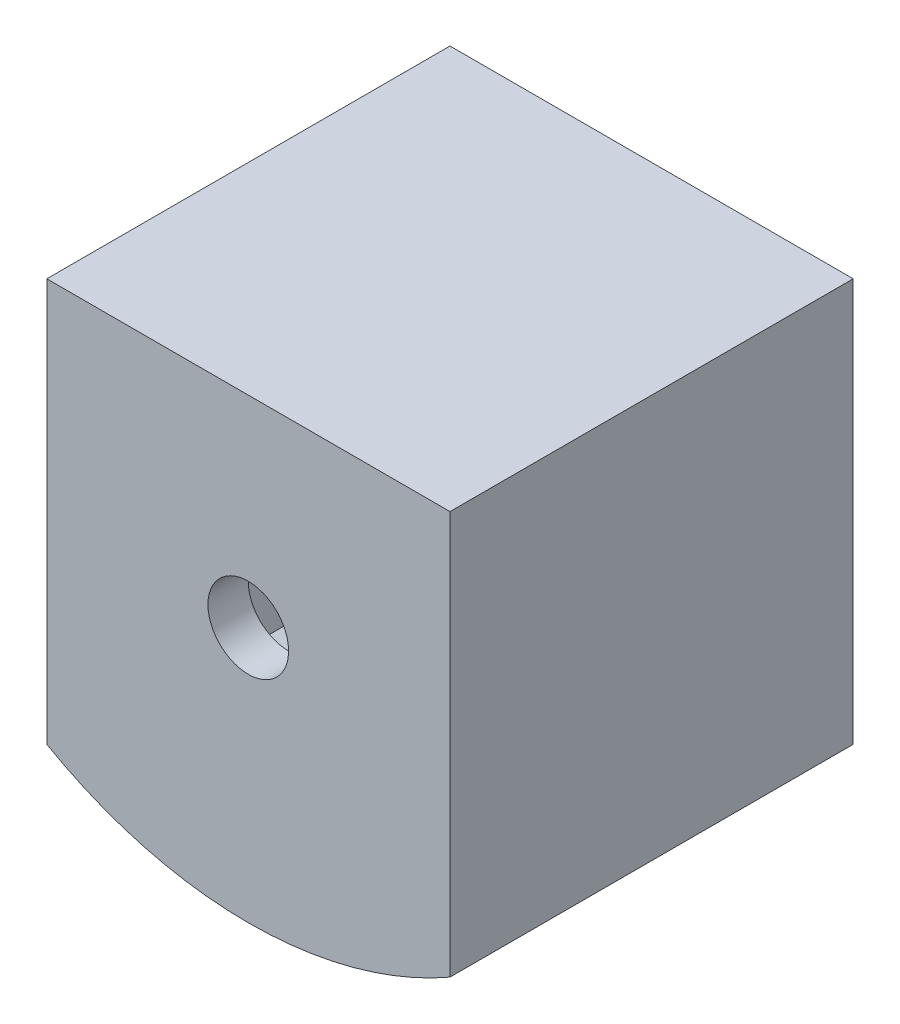
ISO-10303-21;
HEADER;
FILE_DESCRIPTION(('STEP AP214'),'2;1');
FILE_NAME('part.step','',(''),(''),'','','');
FILE_SCHEMA(('AUTOMOTIVE_DESIGN { 1 0 10303 214 1 1 1 1 }'));
ENDSEC;
DATA;
#1=APPLICATION_CONTEXT('core data for automotive mechanical design processes');
#2=APPLICATION_PROTOCOL_DEFINITION('international standard','automotive_design',2000,#1);
#3=PRODUCT_CONTEXT('',#1,'mechanical');
#4=PRODUCT('Part','Part','',(#3));
#5=PRODUCT_RELATED_PRODUCT_CATEGORY('part','',(#4));
#6=PRODUCT_DEFINITION_FORMATION('','',#4);
#7=PRODUCT_DEFINITION_CONTEXT('part definition',#1,'design');
#8=PRODUCT_DEFINITION('design','',#6,#7);
#9=PRODUCT_DEFINITION_SHAPE('','',#8);
#10=(LENGTH_UNIT() NAMED_UNIT(*) SI_UNIT(.MILLI.,.METRE.));
#11=(NAMED_UNIT(*) PLANE_ANGLE_UNIT() SI_UNIT($,.RADIAN.));
#12=(NAMED_UNIT(*) SI_UNIT($,.STERADIAN.) SOLID_ANGLE_UNIT());
#13=UNCERTAINTY_MEASURE_WITH_UNIT(LENGTH_MEASURE(1.E-05),#10,'distance_accuracy_value','');
#14=(GEOMETRIC_REPRESENTATION_CONTEXT(3) GLOBAL_UNCERTAINTY_ASSIGNED_CONTEXT((#13)) GLOBAL_UNIT_ASSIGNED_CONTEXT((#10,
#11,#12)) REPRESENTATION_CONTEXT('',''));
#15=CARTESIAN_POINT('',(0.,0.,0.));
#16=DIRECTION('',(0.,0.,1.));
#17=DIRECTION('',(1.,0.,0.));
#18=AXIS2_PLACEMENT_3D('',#15,#16,#17);
#19=CARTESIAN_POINT('',(-15.,-15.,30.));
#20=DIRECTION('',(1.,0.,0.));
#21=DIRECTION('',(0.,1.,0.));
#22=AXIS2_PLACEMENT_3D('',#19,#20,#21);
#23=PLANE('',#22);
#24=DIRECTION('',(0.,-1.,0.));
#25=VECTOR('',#24,1.);
#26=CARTESIAN_POINT('',(-15.,-15.,0.));
#27=LINE('',#26,#25);
#28=CARTESIAN_POINT('',(-15.,15.,0.));
#29=VERTEX_POINT('',#28);
#30=CARTESIAN_POINT('',(-15.,-15.,0.));
#31=VERTEX_POINT('',#30);
#32=EDGE_CURVE('E337',#29,#31,#27,.T.);
#33=ORIENTED_EDGE('',*,*,#32,.T.);
#34=DIRECTION('',(0.,0.,-1.));
#35=VECTOR('',#34,1.);
#36=CARTESIAN_POINT('',(-15.,-15.,30.));
#37=LINE('',#36,#35);
#38=CARTESIAN_POINT('',(-15.,-15.,30.));
#39=VERTEX_POINT('',#38);
#40=EDGE_CURVE('E11',#39,#31,#37,.T.);
#41=ORIENTED_EDGE('',*,*,#40,.F.);
#42=DIRECTION('',(0.,-1.,0.));
#43=VECTOR('',#42,1.);
#44=CARTESIAN_POINT('',(-15.,-15.,30.));
#45=LINE('',#44,#43);
#46=CARTESIAN_POINT('',(-15.,15.,30.));
#47=VERTEX_POINT('',#46);
#48=EDGE_CURVE('E365',#47,#39,#45,.T.);
#49=ORIENTED_EDGE('',*,*,#48,.F.);
#50=DIRECTION('',(0.,0.,-1.));
#51=VECTOR('',#50,1.);
#52=CARTESIAN_POINT('',(-15.,15.,30.));
#53=LINE('',#52,#51);
#54=EDGE_CURVE('E375',#47,#29,#53,.T.);
#55=ORIENTED_EDGE('',*,*,#54,.T.);
#56=EDGE_LOOP('',(#33,#41,#49,#55));
#57=FACE_BOUND('',#56,.T.);
#58=ADVANCED_FACE('F35',(#57),#23,.F.);
#59=CARTESIAN_POINT('',(0.,11.0897908705464,30.));
#60=DIRECTION('',(0.,0.,-1.));
#61=DIRECTION('',(-1.,0.,0.));
#62=AXIS2_PLACEMENT_3D('',#59,#60,#61);
#63=CYLINDRICAL_SURFACE('',#62,30.0944710481651);
#64=CARTESIAN_POINT('',(0.,11.0897908705464,0.));
#65=DIRECTION('',(0.,0.,1.));
#66=DIRECTION('',(1.,0.,0.));
#67=AXIS2_PLACEMENT_3D('',#64,#65,#66);
#68=CIRCLE('',#67,30.0944710481651);
#69=CARTESIAN_POINT('',(15.,-15.,0.));
#70=VERTEX_POINT('',#69);
#71=EDGE_CURVE('E378',#31,#70,#68,.T.);
#72=ORIENTED_EDGE('',*,*,#71,.T.);
#73=DIRECTION('',(0.,0.,-1.));
#74=VECTOR('',#73,1.);
#75=CARTESIAN_POINT('',(15.,-15.,30.));
#76=LINE('',#75,#74);
#77=CARTESIAN_POINT('',(15.,-15.,30.));
#78=VERTEX_POINT('',#77);
#79=EDGE_CURVE('E42',#78,#70,#76,.T.);
#80=ORIENTED_EDGE('',*,*,#79,.F.);
#81=CARTESIAN_POINT('',(0.,11.0897908705464,30.));
#82=DIRECTION('',(0.,0.,1.));
#83=DIRECTION('',(1.,0.,0.));
#84=AXIS2_PLACEMENT_3D('',#81,#82,#83);
#85=CIRCLE('',#84,30.0944710481651);
#86=EDGE_CURVE('E368',#39,#78,#85,.T.);
#87=ORIENTED_EDGE('',*,*,#86,.F.);
#88=ORIENTED_EDGE('',*,*,#40,.T.);
#89=EDGE_LOOP('',(#72,#80,#87,#88));
#90=FACE_BOUND('',#89,.T.);
#91=ADVANCED_FACE('F408',(#90),#63,.T.);
#92=CARTESIAN_POINT('',(15.,-15.,30.));
#93=DIRECTION('',(-1.,0.,0.));
#94=DIRECTION('',(0.,-1.,0.));
#95=AXIS2_PLACEMENT_3D('',#92,#93,#94);
#96=PLANE('',#95);
#97=DIRECTION('',(0.,1.,0.));
#98=VECTOR('',#97,1.);
#99=CARTESIAN_POINT('',(15.,-15.,0.));
#100=LINE('',#99,#98);
#101=CARTESIAN_POINT('',(15.,15.,0.));
#102=VERTEX_POINT('',#101);
#103=EDGE_CURVE('E380',#70,#102,#100,.T.);
#104=ORIENTED_EDGE('',*,*,#103,.T.);
#105=DIRECTION('',(0.,0.,-1.));
#106=VECTOR('',#105,1.);
#107=CARTESIAN_POINT('',(15.,15.,30.));
#108=LINE('',#107,#106);
#109=CARTESIAN_POINT('',(15.,15.,30.));
#110=VERTEX_POINT('',#109);
#111=EDGE_CURVE('E385',#110,#102,#108,.T.);
#112=ORIENTED_EDGE('',*,*,#111,.F.);
#113=DIRECTION('',(0.,1.,0.));
#114=VECTOR('',#113,1.);
#115=CARTESIAN_POINT('',(15.,-15.,30.));
#116=LINE('',#115,#114);
#117=EDGE_CURVE('E371',#78,#110,#116,.T.);
#118=ORIENTED_EDGE('',*,*,#117,.F.);
#119=ORIENTED_EDGE('',*,*,#79,.T.);
#120=EDGE_LOOP('',(#104,#112,#118,#119));
#121=FACE_BOUND('',#120,.T.);
#122=ADVANCED_FACE('F392',(#121),#96,.F.);
#123=CARTESIAN_POINT('',(15.,15.,30.));
#124=DIRECTION('',(0.,-1.,0.));
#125=DIRECTION('',(0.,0.,-1.));
#126=AXIS2_PLACEMENT_3D('',#123,#124,#125);
#127=PLANE('',#126);
#128=DIRECTION('',(-1.,0.,0.));
#129=VECTOR('',#128,1.);
#130=CARTESIAN_POINT('',(15.,15.,0.));
#131=LINE('',#130,#129);
#132=EDGE_CURVE('E369',#102,#29,#131,.T.);
#133=ORIENTED_EDGE('',*,*,#132,.T.);
#134=ORIENTED_EDGE('',*,*,#54,.F.);
#135=DIRECTION('',(-1.,0.,0.));
#136=VECTOR('',#135,1.);
#137=CARTESIAN_POINT('',(15.,15.,30.));
#138=LINE('',#137,#136);
#139=EDGE_CURVE('E373',#110,#47,#138,.T.);
#140=ORIENTED_EDGE('',*,*,#139,.F.);
#141=ORIENTED_EDGE('',*,*,#111,.T.);
#142=EDGE_LOOP('',(#133,#134,#140,#141));
#143=FACE_BOUND('',#142,.T.);
#144=ADVANCED_FACE('F401',(#143),#127,.F.);
#145=CARTESIAN_POINT('',(0.,11.0897908705464,30.));
#146=DIRECTION('',(0.,0.,1.));
#147=DIRECTION('',(1.,0.,0.));
#148=AXIS2_PLACEMENT_3D('',#145,#146,#147);
#149=PLANE('',#148);
#150=CARTESIAN_POINT('',(-0.0102597379063596,0.00757269740248034,30.));
#151=DIRECTION('',(0.,0.,-1.));
#152=DIRECTION('',(-1.,0.,0.));
#153=AXIS2_PLACEMENT_3D('',#150,#151,#152);
#154=CIRCLE('',#153,3.);
#155=CARTESIAN_POINT('',(-3.01025973790636,0.00757269740248034,30.));
#156=VERTEX_POINT('',#155);
#157=EDGE_CURVE('E328',#156,#156,#154,.T.);
#158=ORIENTED_EDGE('',*,*,#157,.T.);
#159=EDGE_LOOP('',(#158));
#160=FACE_BOUND('',#159,.T.);
#161=ORIENTED_EDGE('',*,*,#48,.T.);
#162=ORIENTED_EDGE('',*,*,#86,.T.);
#163=ORIENTED_EDGE('',*,*,#117,.T.);
#164=ORIENTED_EDGE('',*,*,#139,.T.);
#165=EDGE_LOOP('',(#161,#162,#163,#164));
#166=FACE_BOUND('',#165,.T.);
#167=ADVANCED_FACE('F407',(#160,#166),#149,.T.);
#168=CARTESIAN_POINT('',(0.,11.0897908705464,0.));
#169=DIRECTION('',(0.,0.,1.));
#170=DIRECTION('',(1.,0.,0.));
#171=AXIS2_PLACEMENT_3D('',#168,#169,#170);
#172=PLANE('',#171);
#173=DIRECTION('',(-1.,0.,0.));
#174=VECTOR('',#173,1.);
#175=CARTESIAN_POINT('',(5.,13.,0.));
#176=LINE('',#175,#174);
#177=CARTESIAN_POINT('',(5.,13.,0.));
#178=VERTEX_POINT('',#177);
#179=CARTESIAN_POINT('',(-5.,13.,0.));
#180=VERTEX_POINT('',#179);
#181=EDGE_CURVE('E224',#178,#180,#176,.T.);
#182=ORIENTED_EDGE('',*,*,#181,.F.);
#183=DIRECTION('',(0.,-1.,0.));
#184=VECTOR('',#183,1.);
#185=CARTESIAN_POINT('',(5.,14.,0.));
#186=LINE('',#185,#184);
#187=CARTESIAN_POINT('',(5.,14.,0.));
#188=VERTEX_POINT('',#187);
#189=EDGE_CURVE('E49',#188,#178,#186,.T.);
#190=ORIENTED_EDGE('',*,*,#189,.F.);
#191=DIRECTION('',(1.,0.,0.));
#192=VECTOR('',#191,1.);
#193=CARTESIAN_POINT('',(5.,14.,0.));
#194=LINE('',#193,#192);
#195=CARTESIAN_POINT('',(-5.,14.,0.));
#196=VERTEX_POINT('',#195);
#197=EDGE_CURVE('E215',#196,#188,#194,.T.);
#198=ORIENTED_EDGE('',*,*,#197,.F.);
#199=DIRECTION('',(0.,1.,0.));
#200=VECTOR('',#199,1.);
#201=CARTESIAN_POINT('',(-5.,14.,0.));
#202=LINE('',#201,#200);
#203=EDGE_CURVE('E218',#180,#196,#202,.T.);
#204=ORIENTED_EDGE('',*,*,#203,.F.);
#205=EDGE_LOOP('',(#182,#190,#198,#204));
#206=FACE_BOUND('',#205,.T.);
#207=DIRECTION('',(-1.,0.,0.));
#208=VECTOR('',#207,1.);
#209=CARTESIAN_POINT('',(14.,-5.,0.));
#210=LINE('',#209,#208);
#211=CARTESIAN_POINT('',(14.,-5.,0.));
#212=VERTEX_POINT('',#211);
#213=CARTESIAN_POINT('',(13.,-5.,0.));
#214=VERTEX_POINT('',#213);
#215=EDGE_CURVE('E250',#212,#214,#210,.T.);
#216=ORIENTED_EDGE('',*,*,#215,.F.);
#217=DIRECTION('',(0.,-1.,0.));
#218=VECTOR('',#217,1.);
#219=CARTESIAN_POINT('',(14.,5.,0.));
#220=LINE('',#219,#218);
#221=CARTESIAN_POINT('',(14.,5.,0.));
#222=VERTEX_POINT('',#221);
#223=EDGE_CURVE('E57',#222,#212,#220,.T.);
#224=ORIENTED_EDGE('',*,*,#223,.F.);
#225=DIRECTION('',(1.,0.,0.));
#226=VECTOR('',#225,1.);
#227=CARTESIAN_POINT('',(14.,5.,0.));
#228=LINE('',#227,#226);
#229=CARTESIAN_POINT('',(13.,5.,0.));
#230=VERTEX_POINT('',#229);
#231=EDGE_CURVE('E239',#230,#222,#228,.T.);
#232=ORIENTED_EDGE('',*,*,#231,.F.);
#233=DIRECTION('',(0.,1.,0.));
#234=VECTOR('',#233,1.);
#235=CARTESIAN_POINT('',(13.,5.,0.));
#236=LINE('',#235,#234);
#237=EDGE_CURVE('E254',#214,#230,#236,.T.);
#238=ORIENTED_EDGE('',*,*,#237,.F.);
#239=EDGE_LOOP('',(#216,#224,#232,#238));
#240=FACE_BOUND('',#239,.T.);
#241=DIRECTION('',(-1.,0.,0.));
#242=VECTOR('',#241,1.);
#243=CARTESIAN_POINT('',(3.5,-18.,0.));
#244=LINE('',#243,#242);
#245=CARTESIAN_POINT('',(3.5,-18.,0.));
#246=VERTEX_POINT('',#245);
#247=CARTESIAN_POINT('',(-3.5,-18.,0.));
#248=VERTEX_POINT('',#247);
#249=EDGE_CURVE('E281',#246,#248,#244,.T.);
#250=ORIENTED_EDGE('',*,*,#249,.F.);
#251=DIRECTION('',(0.,-1.,0.));
#252=VECTOR('',#251,1.);
#253=CARTESIAN_POINT('',(3.5,-17.,0.));
#254=LINE('',#253,#252);
#255=CARTESIAN_POINT('',(3.5,-17.,0.));
#256=VERTEX_POINT('',#255);
#257=EDGE_CURVE('E279',#256,#246,#254,.T.);
#258=ORIENTED_EDGE('',*,*,#257,.F.);
#259=DIRECTION('',(1.,0.,0.));
#260=VECTOR('',#259,1.);
#261=CARTESIAN_POINT('',(3.5,-17.,0.));
#262=LINE('',#261,#260);
#263=CARTESIAN_POINT('',(-3.5,-17.,0.));
#264=VERTEX_POINT('',#263);
#265=EDGE_CURVE('E269',#264,#256,#262,.T.);
#266=ORIENTED_EDGE('',*,*,#265,.F.);
#267=DIRECTION('',(0.,1.,0.));
#268=VECTOR('',#267,1.);
#269=CARTESIAN_POINT('',(-3.5,-17.,0.));
#270=LINE('',#269,#268);
#271=EDGE_CURVE('E285',#248,#264,#270,.T.);
#272=ORIENTED_EDGE('',*,*,#271,.F.);
#273=EDGE_LOOP('',(#250,#258,#266,#272));
#274=FACE_BOUND('',#273,.T.);
#275=DIRECTION('',(-1.,0.,0.));
#276=VECTOR('',#275,1.);
#277=CARTESIAN_POINT('',(-13.,-5.,0.));
#278=LINE('',#277,#276);
#279=CARTESIAN_POINT('',(-13.,-5.,0.));
#280=VERTEX_POINT('',#279);
#281=CARTESIAN_POINT('',(-14.,-5.,0.));
#282=VERTEX_POINT('',#281);
#283=EDGE_CURVE('E313',#280,#282,#278,.T.);
#284=ORIENTED_EDGE('',*,*,#283,.F.);
#285=DIRECTION('',(0.,-1.,0.));
#286=VECTOR('',#285,1.);
#287=CARTESIAN_POINT('',(-13.,5.,0.));
#288=LINE('',#287,#286);
#289=CARTESIAN_POINT('',(-13.,5.,0.));
#290=VERTEX_POINT('',#289);
#291=EDGE_CURVE('E311',#290,#280,#288,.T.);
#292=ORIENTED_EDGE('',*,*,#291,.F.);
#293=DIRECTION('',(1.,0.,0.));
#294=VECTOR('',#293,1.);
#295=CARTESIAN_POINT('',(-13.,5.,0.));
#296=LINE('',#295,#294);
#297=CARTESIAN_POINT('',(-14.,5.,0.));
#298=VERTEX_POINT('',#297);
#299=EDGE_CURVE('E301',#298,#290,#296,.T.);
#300=ORIENTED_EDGE('',*,*,#299,.F.);
#301=DIRECTION('',(0.,1.,0.));
#302=VECTOR('',#301,1.);
#303=CARTESIAN_POINT('',(-14.,5.,0.));
#304=LINE('',#303,#302);
#305=EDGE_CURVE('E316',#282,#298,#304,.T.);
#306=ORIENTED_EDGE('',*,*,#305,.F.);
#307=EDGE_LOOP('',(#284,#292,#300,#306));
#308=FACE_BOUND('',#307,.T.);
#309=DIRECTION('',(-1.,0.,0.));
#310=VECTOR('',#309,1.);
#311=CARTESIAN_POINT('',(15.,12.,0.));
#312=LINE('',#311,#310);
#313=CARTESIAN_POINT('',(12.,12.,0.));
#314=VERTEX_POINT('',#313);
#315=CARTESIAN_POINT('',(-12.,12.,0.));
#316=VERTEX_POINT('',#315);
#317=EDGE_CURVE('E343',#314,#316,#312,.T.);
#318=ORIENTED_EDGE('',*,*,#317,.T.);
#319=DIRECTION('',(0.,-1.,0.));
#320=VECTOR('',#319,1.);
#321=CARTESIAN_POINT('',(-12.,-15.,0.));
#322=LINE('',#321,#320);
#323=CARTESIAN_POINT('',(-12.,-13.2023963792641,0.));
#324=VERTEX_POINT('',#323);
#325=EDGE_CURVE('E331',#316,#324,#322,.T.);
#326=ORIENTED_EDGE('',*,*,#325,.T.);
#327=CARTESIAN_POINT('',(0.,11.0897908705464,0.));
#328=DIRECTION('',(0.,0.,1.));
#329=DIRECTION('',(1.,0.,0.));
#330=AXIS2_PLACEMENT_3D('',#327,#328,#329);
#331=CIRCLE('',#330,27.0944710481651);
#332=CARTESIAN_POINT('',(12.,-13.2023963792641,0.));
#333=VERTEX_POINT('',#332);
#334=EDGE_CURVE('E357',#324,#333,#331,.T.);
#335=ORIENTED_EDGE('',*,*,#334,.T.);
#336=DIRECTION('',(0.,1.,0.));
#337=VECTOR('',#336,1.);
#338=CARTESIAN_POINT('',(12.,-15.,0.));
#339=LINE('',#338,#337);
#340=EDGE_CURVE('E360',#333,#314,#339,.T.);
#341=ORIENTED_EDGE('',*,*,#340,.T.);
#342=EDGE_LOOP('',(#318,#326,#335,#341));
#343=FACE_BOUND('',#342,.T.);
#344=ORIENTED_EDGE('',*,*,#32,.F.);
#345=ORIENTED_EDGE('',*,*,#132,.F.);
#346=ORIENTED_EDGE('',*,*,#103,.F.);
#347=ORIENTED_EDGE('',*,*,#71,.F.);
#348=EDGE_LOOP('',(#344,#345,#346,#347));
#349=FACE_BOUND('',#348,.T.);
#350=ADVANCED_FACE('F398',(#206,#240,#274,#308,#343,#349),#172,.F.);
#351=CARTESIAN_POINT('',(-12.,-15.,30.));
#352=DIRECTION('',(1.,0.,0.));
#353=DIRECTION('',(0.,1.,0.));
#354=AXIS2_PLACEMENT_3D('',#351,#352,#353);
#355=PLANE('',#354);
#356=ORIENTED_EDGE('',*,*,#325,.F.);
#357=DIRECTION('',(0.,0.,-1.));
#358=VECTOR('',#357,1.);
#359=CARTESIAN_POINT('',(-12.,12.,30.));
#360=LINE('',#359,#358);
#361=CARTESIAN_POINT('',(-12.,12.,27.));
#362=VERTEX_POINT('',#361);
#363=EDGE_CURVE('E344',#362,#316,#360,.T.);
#364=ORIENTED_EDGE('',*,*,#363,.F.);
#365=DIRECTION('',(0.,-1.,0.));
#366=VECTOR('',#365,1.);
#367=CARTESIAN_POINT('',(-12.,-15.,27.));
#368=LINE('',#367,#366);
#369=CARTESIAN_POINT('',(-12.,-13.2023963792641,27.));
#370=VERTEX_POINT('',#369);
#371=EDGE_CURVE('E339',#362,#370,#368,.T.);
#372=ORIENTED_EDGE('',*,*,#371,.T.);
#373=DIRECTION('',(0.,0.,-1.));
#374=VECTOR('',#373,1.);
#375=CARTESIAN_POINT('',(-12.,-13.2023963792641,27.));
#376=LINE('',#375,#374);
#377=EDGE_CURVE('E334',#370,#324,#376,.T.);
#378=ORIENTED_EDGE('',*,*,#377,.T.);
#379=EDGE_LOOP('',(#356,#364,#372,#378));
#380=FACE_BOUND('',#379,.T.);
#381=ADVANCED_FACE('F420',(#380),#355,.T.);
#382=CARTESIAN_POINT('',(0.,11.0897908705464,30.));
#383=DIRECTION('',(0.,0.,-1.));
#384=DIRECTION('',(-1.,0.,0.));
#385=AXIS2_PLACEMENT_3D('',#382,#383,#384);
#386=CYLINDRICAL_SURFACE('',#385,27.0944710481651);
#387=ORIENTED_EDGE('',*,*,#334,.F.);
#388=ORIENTED_EDGE('',*,*,#377,.F.);
#389=CARTESIAN_POINT('',(0.,11.0897908705464,27.));
#390=DIRECTION('',(0.,0.,1.));
#391=DIRECTION('',(1.,0.,0.));
#392=AXIS2_PLACEMENT_3D('',#389,#390,#391);
#393=CIRCLE('',#392,27.0944710481651);
#394=CARTESIAN_POINT('',(12.,-13.2023963792641,27.));
#395=VERTEX_POINT('',#394);
#396=EDGE_CURVE('E342',#370,#395,#393,.T.);
#397=ORIENTED_EDGE('',*,*,#396,.T.);
#398=DIRECTION('',(0.,0.,-1.));
#399=VECTOR('',#398,1.);
#400=CARTESIAN_POINT('',(12.,-13.2023963792641,27.));
#401=LINE('',#400,#399);
#402=EDGE_CURVE('E338',#395,#333,#401,.T.);
#403=ORIENTED_EDGE('',*,*,#402,.T.);
#404=EDGE_LOOP('',(#387,#388,#397,#403));
#405=FACE_BOUND('',#404,.T.);
#406=ADVANCED_FACE('F437',(#405),#386,.F.);
#407=CARTESIAN_POINT('',(12.,-15.,30.));
#408=DIRECTION('',(-1.,0.,0.));
#409=DIRECTION('',(0.,-1.,0.));
#410=AXIS2_PLACEMENT_3D('',#407,#408,#409);
#411=PLANE('',#410);
#412=ORIENTED_EDGE('',*,*,#340,.F.);
#413=ORIENTED_EDGE('',*,*,#402,.F.);
#414=DIRECTION('',(0.,1.,0.));
#415=VECTOR('',#414,1.);
#416=CARTESIAN_POINT('',(12.,-15.,27.));
#417=LINE('',#416,#415);
#418=CARTESIAN_POINT('',(12.,12.,27.));
#419=VERTEX_POINT('',#418);
#420=EDGE_CURVE('E351',#395,#419,#417,.T.);
#421=ORIENTED_EDGE('',*,*,#420,.T.);
#422=DIRECTION('',(0.,0.,-1.));
#423=VECTOR('',#422,1.);
#424=CARTESIAN_POINT('',(12.,12.,30.));
#425=LINE('',#424,#423);
#426=EDGE_CURVE('E346',#419,#314,#425,.T.);
#427=ORIENTED_EDGE('',*,*,#426,.T.);
#428=EDGE_LOOP('',(#412,#413,#421,#427));
#429=FACE_BOUND('',#428,.T.);
#430=ADVANCED_FACE('F433',(#429),#411,.T.);
#431=CARTESIAN_POINT('',(15.,12.,30.));
#432=DIRECTION('',(0.,-1.,0.));
#433=DIRECTION('',(0.,0.,-1.));
#434=AXIS2_PLACEMENT_3D('',#431,#432,#433);
#435=PLANE('',#434);
#436=ORIENTED_EDGE('',*,*,#317,.F.);
#437=ORIENTED_EDGE('',*,*,#426,.F.);
#438=DIRECTION('',(-1.,0.,0.));
#439=VECTOR('',#438,1.);
#440=CARTESIAN_POINT('',(15.,12.,27.));
#441=LINE('',#440,#439);
#442=EDGE_CURVE('E347',#419,#362,#441,.T.);
#443=ORIENTED_EDGE('',*,*,#442,.T.);
#444=ORIENTED_EDGE('',*,*,#363,.T.);
#445=EDGE_LOOP('',(#436,#437,#443,#444));
#446=FACE_BOUND('',#445,.T.);
#447=ADVANCED_FACE('F429',(#446),#435,.T.);
#448=CARTESIAN_POINT('',(0.,11.0897908705464,27.));
#449=DIRECTION('',(0.,0.,1.));
#450=DIRECTION('',(1.,0.,0.));
#451=AXIS2_PLACEMENT_3D('',#448,#449,#450);
#452=PLANE('',#451);
#453=CARTESIAN_POINT('',(-0.0102597379063596,0.00757269740248034,27.));
#454=DIRECTION('',(0.,0.,-1.));
#455=DIRECTION('',(-1.,0.,0.));
#456=AXIS2_PLACEMENT_3D('',#453,#454,#455);
#457=CIRCLE('',#456,3.);
#458=CARTESIAN_POINT('',(-3.01025973790636,0.00757269740248034,27.));
#459=VERTEX_POINT('',#458);
#460=EDGE_CURVE('E231',#459,#459,#457,.T.);
#461=ORIENTED_EDGE('',*,*,#460,.F.);
#462=EDGE_LOOP('',(#461));
#463=FACE_BOUND('',#462,.T.);
#464=ORIENTED_EDGE('',*,*,#371,.F.);
#465=ORIENTED_EDGE('',*,*,#442,.F.);
#466=ORIENTED_EDGE('',*,*,#420,.F.);
#467=ORIENTED_EDGE('',*,*,#396,.F.);
#468=EDGE_LOOP('',(#464,#465,#466,#467));
#469=FACE_BOUND('',#468,.T.);
#470=ADVANCED_FACE('F425',(#463,#469),#452,.F.);
#471=CARTESIAN_POINT('',(-0.0102597379063596,0.00757269740248034,30.));
#472=DIRECTION('',(0.,0.,-1.));
#473=DIRECTION('',(-1.,0.,0.));
#474=AXIS2_PLACEMENT_3D('',#471,#472,#473);
#475=CYLINDRICAL_SURFACE('',#474,3.);
#476=ORIENTED_EDGE('',*,*,#157,.F.);
#477=EDGE_LOOP('',(#476));
#478=FACE_BOUND('',#477,.T.);
#479=ORIENTED_EDGE('',*,*,#460,.T.);
#480=EDGE_LOOP('',(#479));
#481=FACE_BOUND('',#480,.T.);
#482=ADVANCED_FACE('F428',(#478,#481),#475,.F.);
#483=CARTESIAN_POINT('',(-13.,5.,5.));
#484=DIRECTION('',(1.,0.,0.));
#485=DIRECTION('',(0.,0.,-1.));
#486=AXIS2_PLACEMENT_3D('',#483,#484,#485);
#487=PLANE('',#486);
#488=ORIENTED_EDGE('',*,*,#291,.T.);
#489=DIRECTION('',(0.,0.,-1.));
#490=VECTOR('',#489,1.);
#491=CARTESIAN_POINT('',(-13.,-5.,5.));
#492=LINE('',#491,#490);
#493=CARTESIAN_POINT('',(-13.,-5.,5.));
#494=VERTEX_POINT('',#493);
#495=EDGE_CURVE('E310',#494,#280,#492,.T.);
#496=ORIENTED_EDGE('',*,*,#495,.F.);
#497=DIRECTION('',(0.,-1.,0.));
#498=VECTOR('',#497,1.);
#499=CARTESIAN_POINT('',(-13.,5.,5.));
#500=LINE('',#499,#498);
#501=CARTESIAN_POINT('',(-13.,5.,5.));
#502=VERTEX_POINT('',#501);
#503=EDGE_CURVE('E297',#502,#494,#500,.T.);
#504=ORIENTED_EDGE('',*,*,#503,.F.);
#505=DIRECTION('',(0.,0.,-1.));
#506=VECTOR('',#505,1.);
#507=CARTESIAN_POINT('',(-13.,5.,5.));
#508=LINE('',#507,#506);
#509=EDGE_CURVE('E282',#502,#290,#508,.T.);
#510=ORIENTED_EDGE('',*,*,#509,.T.);
#511=EDGE_LOOP('',(#488,#496,#504,#510));
#512=FACE_BOUND('',#511,.T.);
#513=ADVANCED_FACE('F447',(#512),#487,.F.);
#514=CARTESIAN_POINT('',(-13.,5.,5.));
#515=DIRECTION('',(0.,1.,0.));
#516=DIRECTION('',(0.,0.,1.));
#517=AXIS2_PLACEMENT_3D('',#514,#515,#516);
#518=PLANE('',#517);
#519=ORIENTED_EDGE('',*,*,#299,.T.);
#520=ORIENTED_EDGE('',*,*,#509,.F.);
#521=DIRECTION('',(1.,0.,0.));
#522=VECTOR('',#521,1.);
#523=CARTESIAN_POINT('',(-13.,5.,5.));
#524=LINE('',#523,#522);
#525=CARTESIAN_POINT('',(-14.,5.,5.));
#526=VERTEX_POINT('',#525);
#527=EDGE_CURVE('E307',#526,#502,#524,.T.);
#528=ORIENTED_EDGE('',*,*,#527,.F.);
#529=DIRECTION('',(0.,0.,-1.));
#530=VECTOR('',#529,1.);
#531=CARTESIAN_POINT('',(-14.,5.,5.));
#532=LINE('',#531,#530);
#533=EDGE_CURVE('E322',#526,#298,#532,.T.);
#534=ORIENTED_EDGE('',*,*,#533,.T.);
#535=EDGE_LOOP('',(#519,#520,#528,#534));
#536=FACE_BOUND('',#535,.T.);
#537=ADVANCED_FACE('F451',(#536),#518,.F.);
#538=CARTESIAN_POINT('',(-14.,5.,5.));
#539=DIRECTION('',(-1.,0.,0.));
#540=DIRECTION('',(0.,0.,1.));
#541=AXIS2_PLACEMENT_3D('',#538,#539,#540);
#542=PLANE('',#541);
#543=ORIENTED_EDGE('',*,*,#305,.T.);
#544=ORIENTED_EDGE('',*,*,#533,.F.);
#545=DIRECTION('',(0.,1.,0.));
#546=VECTOR('',#545,1.);
#547=CARTESIAN_POINT('',(-14.,5.,5.));
#548=LINE('',#547,#546);
#549=CARTESIAN_POINT('',(-14.,-5.,5.));
#550=VERTEX_POINT('',#549);
#551=EDGE_CURVE('E304',#550,#526,#548,.T.);
#552=ORIENTED_EDGE('',*,*,#551,.F.);
#553=DIRECTION('',(0.,0.,-1.));
#554=VECTOR('',#553,1.);
#555=CARTESIAN_POINT('',(-14.,-5.,5.));
#556=LINE('',#555,#554);
#557=EDGE_CURVE('E324',#550,#282,#556,.T.);
#558=ORIENTED_EDGE('',*,*,#557,.T.);
#559=EDGE_LOOP('',(#543,#544,#552,#558));
#560=FACE_BOUND('',#559,.T.);
#561=ADVANCED_FACE('F457',(#560),#542,.F.);
#562=CARTESIAN_POINT('',(-13.,-5.,5.));
#563=DIRECTION('',(0.,-1.,0.));
#564=DIRECTION('',(0.,0.,-1.));
#565=AXIS2_PLACEMENT_3D('',#562,#563,#564);
#566=PLANE('',#565);
#567=ORIENTED_EDGE('',*,*,#283,.T.);
#568=ORIENTED_EDGE('',*,*,#557,.F.);
#569=DIRECTION('',(-1.,0.,0.));
#570=VECTOR('',#569,1.);
#571=CARTESIAN_POINT('',(-13.,-5.,5.));
#572=LINE('',#571,#570);
#573=EDGE_CURVE('E300',#494,#550,#572,.T.);
#574=ORIENTED_EDGE('',*,*,#573,.F.);
#575=ORIENTED_EDGE('',*,*,#495,.T.);
#576=EDGE_LOOP('',(#567,#568,#574,#575));
#577=FACE_BOUND('',#576,.T.);
#578=ADVANCED_FACE('F453',(#577),#566,.F.);
#579=CARTESIAN_POINT('',(0.,0.,5.));
#580=DIRECTION('',(0.,0.,-1.));
#581=DIRECTION('',(-1.,0.,0.));
#582=AXIS2_PLACEMENT_3D('',#579,#580,#581);
#583=PLANE('',#582);
#584=ORIENTED_EDGE('',*,*,#503,.T.);
#585=ORIENTED_EDGE('',*,*,#573,.T.);
#586=ORIENTED_EDGE('',*,*,#551,.T.);
#587=ORIENTED_EDGE('',*,*,#527,.T.);
#588=EDGE_LOOP('',(#584,#585,#586,#587));
#589=FACE_BOUND('',#588,.T.);
#590=ADVANCED_FACE('F456',(#589),#583,.T.);
#591=CARTESIAN_POINT('',(3.5,-17.,5.));
#592=DIRECTION('',(1.,0.,0.));
#593=DIRECTION('',(0.,0.,-1.));
#594=AXIS2_PLACEMENT_3D('',#591,#592,#593);
#595=PLANE('',#594);
#596=ORIENTED_EDGE('',*,*,#257,.T.);
#597=DIRECTION('',(0.,0.,-1.));
#598=VECTOR('',#597,1.);
#599=CARTESIAN_POINT('',(3.5,-18.,5.));
#600=LINE('',#599,#598);
#601=CARTESIAN_POINT('',(3.5,-18.,5.));
#602=VERTEX_POINT('',#601);
#603=EDGE_CURVE('E278',#602,#246,#600,.T.);
#604=ORIENTED_EDGE('',*,*,#603,.F.);
#605=DIRECTION('',(0.,-1.,0.));
#606=VECTOR('',#605,1.);
#607=CARTESIAN_POINT('',(3.5,-17.,5.));
#608=LINE('',#607,#606);
#609=CARTESIAN_POINT('',(3.5,-17.,5.));
#610=VERTEX_POINT('',#609);
#611=EDGE_CURVE('E265',#610,#602,#608,.T.);
#612=ORIENTED_EDGE('',*,*,#611,.F.);
#613=DIRECTION('',(0.,0.,-1.));
#614=VECTOR('',#613,1.);
#615=CARTESIAN_POINT('',(3.5,-17.,5.));
#616=LINE('',#615,#614);
#617=EDGE_CURVE('E251',#610,#256,#616,.T.);
#618=ORIENTED_EDGE('',*,*,#617,.T.);
#619=EDGE_LOOP('',(#596,#604,#612,#618));
#620=FACE_BOUND('',#619,.T.);
#621=ADVANCED_FACE('F467',(#620),#595,.F.);
#622=CARTESIAN_POINT('',(3.5,-17.,5.));
#623=DIRECTION('',(0.,1.,0.));
#624=DIRECTION('',(0.,0.,1.));
#625=AXIS2_PLACEMENT_3D('',#622,#623,#624);
#626=PLANE('',#625);
#627=ORIENTED_EDGE('',*,*,#265,.T.);
#628=ORIENTED_EDGE('',*,*,#617,.F.);
#629=DIRECTION('',(1.,0.,0.));
#630=VECTOR('',#629,1.);
#631=CARTESIAN_POINT('',(3.5,-17.,5.));
#632=LINE('',#631,#630);
#633=CARTESIAN_POINT('',(-3.5,-17.,5.));
#634=VERTEX_POINT('',#633);
#635=EDGE_CURVE('E275',#634,#610,#632,.T.);
#636=ORIENTED_EDGE('',*,*,#635,.F.);
#637=DIRECTION('',(0.,0.,-1.));
#638=VECTOR('',#637,1.);
#639=CARTESIAN_POINT('',(-3.5,-17.,5.));
#640=LINE('',#639,#638);
#641=EDGE_CURVE('E291',#634,#264,#640,.T.);
#642=ORIENTED_EDGE('',*,*,#641,.T.);
#643=EDGE_LOOP('',(#627,#628,#636,#642));
#644=FACE_BOUND('',#643,.T.);
#645=ADVANCED_FACE('F471',(#644),#626,.F.);
#646=CARTESIAN_POINT('',(-3.5,-17.,5.));
#647=DIRECTION('',(-1.,0.,0.));
#648=DIRECTION('',(0.,0.,1.));
#649=AXIS2_PLACEMENT_3D('',#646,#647,#648);
#650=PLANE('',#649);
#651=ORIENTED_EDGE('',*,*,#271,.T.);
#652=ORIENTED_EDGE('',*,*,#641,.F.);
#653=DIRECTION('',(0.,1.,0.));
#654=VECTOR('',#653,1.);
#655=CARTESIAN_POINT('',(-3.5,-17.,5.));
#656=LINE('',#655,#654);
#657=CARTESIAN_POINT('',(-3.5,-18.,5.));
#658=VERTEX_POINT('',#657);
#659=EDGE_CURVE('E272',#658,#634,#656,.T.);
#660=ORIENTED_EDGE('',*,*,#659,.F.);
#661=DIRECTION('',(0.,0.,-1.));
#662=VECTOR('',#661,1.);
#663=CARTESIAN_POINT('',(-3.5,-18.,5.));
#664=LINE('',#663,#662);
#665=EDGE_CURVE('E293',#658,#248,#664,.T.);
#666=ORIENTED_EDGE('',*,*,#665,.T.);
#667=EDGE_LOOP('',(#651,#652,#660,#666));
#668=FACE_BOUND('',#667,.T.);
#669=ADVANCED_FACE('F477',(#668),#650,.F.);
#670=CARTESIAN_POINT('',(3.5,-18.,5.));
#671=DIRECTION('',(0.,-1.,0.));
#672=DIRECTION('',(0.,0.,-1.));
#673=AXIS2_PLACEMENT_3D('',#670,#671,#672);
#674=PLANE('',#673);
#675=ORIENTED_EDGE('',*,*,#249,.T.);
#676=ORIENTED_EDGE('',*,*,#665,.F.);
#677=DIRECTION('',(-1.,0.,0.));
#678=VECTOR('',#677,1.);
#679=CARTESIAN_POINT('',(3.5,-18.,5.));
#680=LINE('',#679,#678);
#681=EDGE_CURVE('E268',#602,#658,#680,.T.);
#682=ORIENTED_EDGE('',*,*,#681,.F.);
#683=ORIENTED_EDGE('',*,*,#603,.T.);
#684=EDGE_LOOP('',(#675,#676,#682,#683));
#685=FACE_BOUND('',#684,.T.);
#686=ADVANCED_FACE('F473',(#685),#674,.F.);
#687=CARTESIAN_POINT('',(0.,0.,5.));
#688=DIRECTION('',(0.,0.,-1.));
#689=DIRECTION('',(-1.,0.,0.));
#690=AXIS2_PLACEMENT_3D('',#687,#688,#689);
#691=PLANE('',#690);
#692=ORIENTED_EDGE('',*,*,#611,.T.);
#693=ORIENTED_EDGE('',*,*,#681,.T.);
#694=ORIENTED_EDGE('',*,*,#659,.T.);
#695=ORIENTED_EDGE('',*,*,#635,.T.);
#696=EDGE_LOOP('',(#692,#693,#694,#695));
#697=FACE_BOUND('',#696,.T.);
#698=ADVANCED_FACE('F476',(#697),#691,.T.);
#699=CARTESIAN_POINT('',(14.,5.,5.));
#700=DIRECTION('',(1.,0.,0.));
#701=DIRECTION('',(0.,0.,-1.));
#702=AXIS2_PLACEMENT_3D('',#699,#700,#701);
#703=PLANE('',#702);
#704=ORIENTED_EDGE('',*,*,#223,.T.);
#705=DIRECTION('',(0.,0.,-1.));
#706=VECTOR('',#705,1.);
#707=CARTESIAN_POINT('',(14.,-5.,5.));
#708=LINE('',#707,#706);
#709=CARTESIAN_POINT('',(14.,-5.,5.));
#710=VERTEX_POINT('',#709);
#711=EDGE_CURVE('E248',#710,#212,#708,.T.);
#712=ORIENTED_EDGE('',*,*,#711,.F.);
#713=DIRECTION('',(0.,-1.,0.));
#714=VECTOR('',#713,1.);
#715=CARTESIAN_POINT('',(14.,5.,5.));
#716=LINE('',#715,#714);
#717=CARTESIAN_POINT('',(14.,5.,5.));
#718=VERTEX_POINT('',#717);
#719=EDGE_CURVE('E235',#718,#710,#716,.T.);
#720=ORIENTED_EDGE('',*,*,#719,.F.);
#721=DIRECTION('',(0.,0.,-1.));
#722=VECTOR('',#721,1.);
#723=CARTESIAN_POINT('',(14.,5.,5.));
#724=LINE('',#723,#722);
#725=EDGE_CURVE('E225',#718,#222,#724,.T.);
#726=ORIENTED_EDGE('',*,*,#725,.T.);
#727=EDGE_LOOP('',(#704,#712,#720,#726));
#728=FACE_BOUND('',#727,.T.);
#729=ADVANCED_FACE('F487',(#728),#703,.F.);
#730=CARTESIAN_POINT('',(14.,5.,5.));
#731=DIRECTION('',(0.,1.,0.));
#732=DIRECTION('',(0.,0.,1.));
#733=AXIS2_PLACEMENT_3D('',#730,#731,#732);
#734=PLANE('',#733);
#735=ORIENTED_EDGE('',*,*,#231,.T.);
#736=ORIENTED_EDGE('',*,*,#725,.F.);
#737=DIRECTION('',(1.,0.,0.));
#738=VECTOR('',#737,1.);
#739=CARTESIAN_POINT('',(14.,5.,5.));
#740=LINE('',#739,#738);
#741=CARTESIAN_POINT('',(13.,5.,5.));
#742=VERTEX_POINT('',#741);
#743=EDGE_CURVE('E245',#742,#718,#740,.T.);
#744=ORIENTED_EDGE('',*,*,#743,.F.);
#745=DIRECTION('',(0.,0.,-1.));
#746=VECTOR('',#745,1.);
#747=CARTESIAN_POINT('',(13.,5.,5.));
#748=LINE('',#747,#746);
#749=EDGE_CURVE('E260',#742,#230,#748,.T.);
#750=ORIENTED_EDGE('',*,*,#749,.T.);
#751=EDGE_LOOP('',(#735,#736,#744,#750));
#752=FACE_BOUND('',#751,.T.);
#753=ADVANCED_FACE('F491',(#752),#734,.F.);
#754=CARTESIAN_POINT('',(13.,5.,5.));
#755=DIRECTION('',(-1.,0.,0.));
#756=DIRECTION('',(0.,0.,1.));
#757=AXIS2_PLACEMENT_3D('',#754,#755,#756);
#758=PLANE('',#757);
#759=ORIENTED_EDGE('',*,*,#237,.T.);
#760=ORIENTED_EDGE('',*,*,#749,.F.);
#761=DIRECTION('',(0.,1.,0.));
#762=VECTOR('',#761,1.);
#763=CARTESIAN_POINT('',(13.,5.,5.));
#764=LINE('',#763,#762);
#765=CARTESIAN_POINT('',(13.,-5.,5.));
#766=VERTEX_POINT('',#765);
#767=EDGE_CURVE('E242',#766,#742,#764,.T.);
#768=ORIENTED_EDGE('',*,*,#767,.F.);
#769=DIRECTION('',(0.,0.,-1.));
#770=VECTOR('',#769,1.);
#771=CARTESIAN_POINT('',(13.,-5.,5.));
#772=LINE('',#771,#770);
#773=EDGE_CURVE('E262',#766,#214,#772,.T.);
#774=ORIENTED_EDGE('',*,*,#773,.T.);
#775=EDGE_LOOP('',(#759,#760,#768,#774));
#776=FACE_BOUND('',#775,.T.);
#777=ADVANCED_FACE('F496',(#776),#758,.F.);
#778=CARTESIAN_POINT('',(14.,-5.,5.));
#779=DIRECTION('',(0.,-1.,0.));
#780=DIRECTION('',(0.,0.,-1.));
#781=AXIS2_PLACEMENT_3D('',#778,#779,#780);
#782=PLANE('',#781);
#783=ORIENTED_EDGE('',*,*,#215,.T.);
#784=ORIENTED_EDGE('',*,*,#773,.F.);
#785=DIRECTION('',(-1.,0.,0.));
#786=VECTOR('',#785,1.);
#787=CARTESIAN_POINT('',(14.,-5.,5.));
#788=LINE('',#787,#786);
#789=EDGE_CURVE('E238',#710,#766,#788,.T.);
#790=ORIENTED_EDGE('',*,*,#789,.F.);
#791=ORIENTED_EDGE('',*,*,#711,.T.);
#792=EDGE_LOOP('',(#783,#784,#790,#791));
#793=FACE_BOUND('',#792,.T.);
#794=ADVANCED_FACE('F492',(#793),#782,.F.);
#795=CARTESIAN_POINT('',(0.,0.,5.));
#796=DIRECTION('',(0.,0.,-1.));
#797=DIRECTION('',(-1.,0.,0.));
#798=AXIS2_PLACEMENT_3D('',#795,#796,#797);
#799=PLANE('',#798);
#800=ORIENTED_EDGE('',*,*,#719,.T.);
#801=ORIENTED_EDGE('',*,*,#789,.T.);
#802=ORIENTED_EDGE('',*,*,#767,.T.);
#803=ORIENTED_EDGE('',*,*,#743,.T.);
#804=EDGE_LOOP('',(#800,#801,#802,#803));
#805=FACE_BOUND('',#804,.T.);
#806=ADVANCED_FACE('F495',(#805),#799,.T.);
#807=CARTESIAN_POINT('',(5.,14.,5.));
#808=DIRECTION('',(1.,0.,0.));
#809=DIRECTION('',(0.,0.,-1.));
#810=AXIS2_PLACEMENT_3D('',#807,#808,#809);
#811=PLANE('',#810);
#812=ORIENTED_EDGE('',*,*,#189,.T.);
#813=DIRECTION('',(0.,0.,-1.));
#814=VECTOR('',#813,1.);
#815=CARTESIAN_POINT('',(5.,13.,5.));
#816=LINE('',#815,#814);
#817=CARTESIAN_POINT('',(5.,13.,5.));
#818=VERTEX_POINT('',#817);
#819=EDGE_CURVE('E193',#818,#178,#816,.T.);
#820=ORIENTED_EDGE('',*,*,#819,.F.);
#821=DIRECTION('',(0.,-1.,0.));
#822=VECTOR('',#821,1.);
#823=CARTESIAN_POINT('',(5.,14.,5.));
#824=LINE('',#823,#822);
#825=CARTESIAN_POINT('',(5.,14.,5.));
#826=VERTEX_POINT('',#825);
#827=EDGE_CURVE('E197',#826,#818,#824,.T.);
#828=ORIENTED_EDGE('',*,*,#827,.F.);
#829=DIRECTION('',(0.,0.,-1.));
#830=VECTOR('',#829,1.);
#831=CARTESIAN_POINT('',(5.,14.,5.));
#832=LINE('',#831,#830);
#833=EDGE_CURVE('E229',#826,#188,#832,.T.);
#834=ORIENTED_EDGE('',*,*,#833,.T.);
#835=EDGE_LOOP('',(#812,#820,#828,#834));
#836=FACE_BOUND('',#835,.T.);
#837=ADVANCED_FACE('F195',(#836),#811,.F.);
#838=CARTESIAN_POINT('',(5.,14.,5.));
#839=DIRECTION('',(0.,1.,0.));
#840=DIRECTION('',(0.,0.,1.));
#841=AXIS2_PLACEMENT_3D('',#838,#839,#840);
#842=PLANE('',#841);
#843=ORIENTED_EDGE('',*,*,#197,.T.);
#844=ORIENTED_EDGE('',*,*,#833,.F.);
#845=DIRECTION('',(1.,0.,0.));
#846=VECTOR('',#845,1.);
#847=CARTESIAN_POINT('',(5.,14.,5.));
#848=LINE('',#847,#846);
#849=CARTESIAN_POINT('',(-5.,14.,5.));
#850=VERTEX_POINT('',#849);
#851=EDGE_CURVE('E203',#850,#826,#848,.T.);
#852=ORIENTED_EDGE('',*,*,#851,.F.);
#853=DIRECTION('',(0.,0.,-1.));
#854=VECTOR('',#853,1.);
#855=CARTESIAN_POINT('',(-5.,14.,5.));
#856=LINE('',#855,#854);
#857=EDGE_CURVE('E232',#850,#196,#856,.T.);
#858=ORIENTED_EDGE('',*,*,#857,.T.);
#859=EDGE_LOOP('',(#843,#844,#852,#858));
#860=FACE_BOUND('',#859,.T.);
#861=ADVANCED_FACE('F509',(#860),#842,.F.);
#862=CARTESIAN_POINT('',(-5.,14.,5.));
#863=DIRECTION('',(-1.,0.,0.));
#864=DIRECTION('',(0.,0.,1.));
#865=AXIS2_PLACEMENT_3D('',#862,#863,#864);
#866=PLANE('',#865);
#867=ORIENTED_EDGE('',*,*,#203,.T.);
#868=ORIENTED_EDGE('',*,*,#857,.F.);
#869=DIRECTION('',(0.,1.,0.));
#870=VECTOR('',#869,1.);
#871=CARTESIAN_POINT('',(-5.,14.,5.));
#872=LINE('',#871,#870);
#873=CARTESIAN_POINT('',(-5.,13.,5.));
#874=VERTEX_POINT('',#873);
#875=EDGE_CURVE('E211',#874,#850,#872,.T.);
#876=ORIENTED_EDGE('',*,*,#875,.F.);
#877=DIRECTION('',(0.,0.,-1.));
#878=VECTOR('',#877,1.);
#879=CARTESIAN_POINT('',(-5.,13.,5.));
#880=LINE('',#879,#878);
#881=EDGE_CURVE('E202',#874,#180,#880,.T.);
#882=ORIENTED_EDGE('',*,*,#881,.T.);
#883=EDGE_LOOP('',(#867,#868,#876,#882));
#884=FACE_BOUND('',#883,.T.);
#885=ADVANCED_FACE('F512',(#884),#866,.F.);
#886=CARTESIAN_POINT('',(5.,13.,5.));
#887=DIRECTION('',(0.,-1.,0.));
#888=DIRECTION('',(0.,0.,-1.));
#889=AXIS2_PLACEMENT_3D('',#886,#887,#888);
#890=PLANE('',#889);
#891=ORIENTED_EDGE('',*,*,#181,.T.);
#892=ORIENTED_EDGE('',*,*,#881,.F.);
#893=DIRECTION('',(-1.,0.,0.));
#894=VECTOR('',#893,1.);
#895=CARTESIAN_POINT('',(5.,13.,5.));
#896=LINE('',#895,#894);
#897=EDGE_CURVE('E206',#818,#874,#896,.T.);
#898=ORIENTED_EDGE('',*,*,#897,.F.);
#899=ORIENTED_EDGE('',*,*,#819,.T.);
#900=EDGE_LOOP('',(#891,#892,#898,#899));
#901=FACE_BOUND('',#900,.T.);
#902=ADVANCED_FACE('F207',(#901),#890,.F.);
#903=CARTESIAN_POINT('',(0.,0.,5.));
#904=DIRECTION('',(0.,0.,-1.));
#905=DIRECTION('',(-1.,0.,0.));
#906=AXIS2_PLACEMENT_3D('',#903,#904,#905);
#907=PLANE('',#906);
#908=ORIENTED_EDGE('',*,*,#827,.T.);
#909=ORIENTED_EDGE('',*,*,#897,.T.);
#910=ORIENTED_EDGE('',*,*,#875,.T.);
#911=ORIENTED_EDGE('',*,*,#851,.T.);
#912=EDGE_LOOP('',(#908,#909,#910,#911));
#913=FACE_BOUND('',#912,.T.);
#914=ADVANCED_FACE('F213',(#913),#907,.T.);
#915=CLOSED_SHELL('',(#58,#91,#122,#144,#167,#350,#381,#406,#430,#447,#470,#482,#513,#537,#561,
#578,#590,#621,#645,#669,#686,#698,#729,#753,#777,#794,#806,#837,#861,#885,#902,#914));
#916=MANIFOLD_SOLID_BREP('B2',#915);
#917=ADVANCED_BREP_SHAPE_REPRESENTATION('',(#18,#916),#14);
#918=SHAPE_DEFINITION_REPRESENTATION(#9,#917);
ENDSEC;
END-ISO-10303-21;
